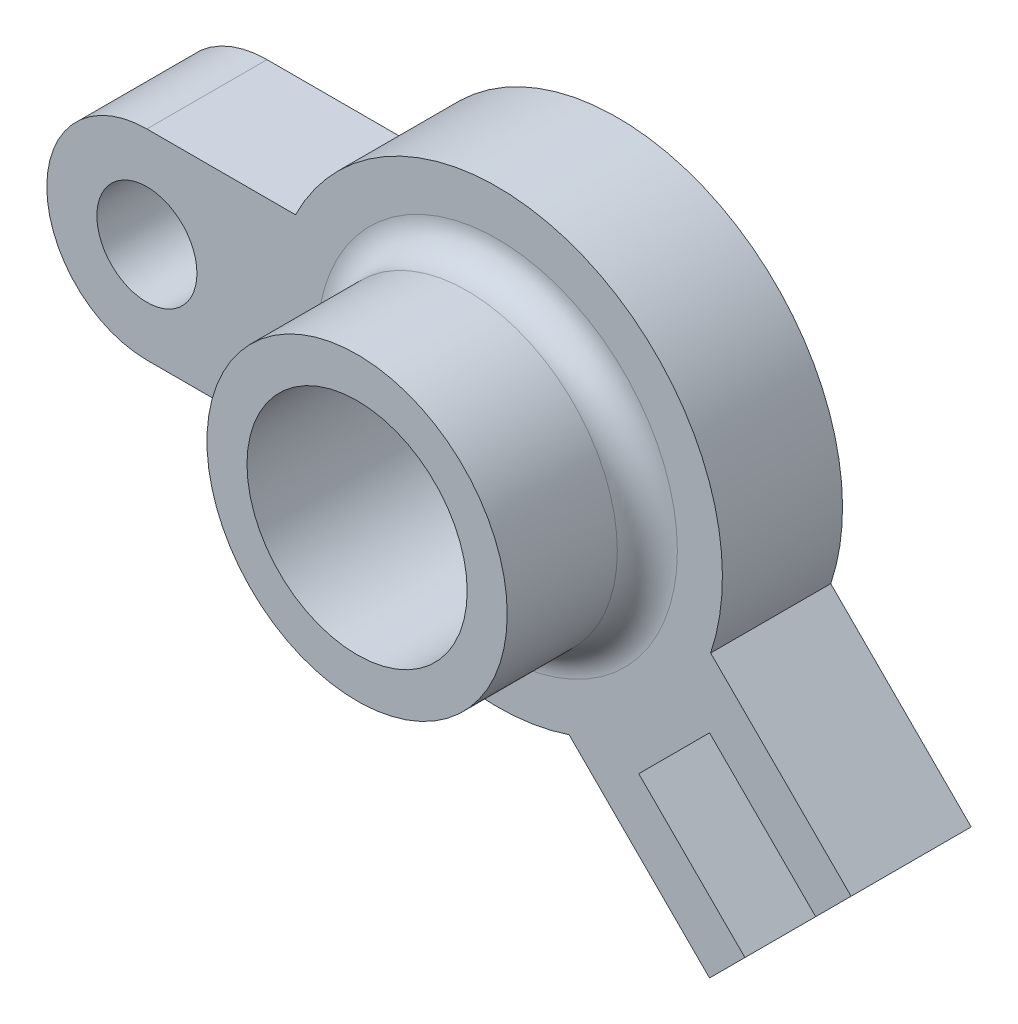
ISO-10303-21;
HEADER;
FILE_DESCRIPTION(('STEP AP214'),'2;1');
FILE_NAME('part.step','',(''),(''),'','','');
FILE_SCHEMA(('AUTOMOTIVE_DESIGN { 1 0 10303 214 1 1 1 1 }'));
ENDSEC;
DATA;
#1=APPLICATION_CONTEXT('core data for automotive mechanical design processes');
#2=APPLICATION_PROTOCOL_DEFINITION('international standard','automotive_design',2000,#1);
#3=PRODUCT_CONTEXT('',#1,'mechanical');
#4=PRODUCT('Part','Part','',(#3));
#5=PRODUCT_RELATED_PRODUCT_CATEGORY('part','',(#4));
#6=PRODUCT_DEFINITION_FORMATION('','',#4);
#7=PRODUCT_DEFINITION_CONTEXT('part definition',#1,'design');
#8=PRODUCT_DEFINITION('design','',#6,#7);
#9=PRODUCT_DEFINITION_SHAPE('','',#8);
#10=(LENGTH_UNIT() NAMED_UNIT(*) SI_UNIT(.MILLI.,.METRE.));
#11=(NAMED_UNIT(*) PLANE_ANGLE_UNIT() SI_UNIT($,.RADIAN.));
#12=(NAMED_UNIT(*) SI_UNIT($,.STERADIAN.) SOLID_ANGLE_UNIT());
#13=UNCERTAINTY_MEASURE_WITH_UNIT(LENGTH_MEASURE(1.E-05),#10,'distance_accuracy_value','');
#14=(GEOMETRIC_REPRESENTATION_CONTEXT(3) GLOBAL_UNCERTAINTY_ASSIGNED_CONTEXT((#13)) GLOBAL_UNIT_ASSIGNED_CONTEXT((#10,
#11,#12)) REPRESENTATION_CONTEXT('',''));
#15=CARTESIAN_POINT('',(0.,0.,0.));
#16=DIRECTION('',(0.,0.,1.));
#17=DIRECTION('',(1.,0.,0.));
#18=AXIS2_PLACEMENT_3D('',#15,#16,#17);
#19=CARTESIAN_POINT('',(0.,0.,12.));
#20=DIRECTION('',(0.,0.,-1.));
#21=DIRECTION('',(-1.,0.,0.));
#22=AXIS2_PLACEMENT_3D('',#19,#20,#21);
#23=CYLINDRICAL_SURFACE('',#22,22.5);
#24=CARTESIAN_POINT('',(0.,0.,0.));
#25=DIRECTION('',(0.,0.,1.));
#26=DIRECTION('',(1.,0.,0.));
#27=AXIS2_PLACEMENT_3D('',#24,#25,#26);
#28=CIRCLE('',#27,22.5);
#29=CARTESIAN_POINT('',(-20.1556443707464,-10.,0.));
#30=VERTEX_POINT('',#29);
#31=CARTESIAN_POINT('',(7.18112500187364,-21.3232606256047,0.));
#32=VERTEX_POINT('',#31);
#33=EDGE_CURVE('E156',#30,#32,#28,.T.);
#34=ORIENTED_EDGE('',*,*,#33,.T.);
#35=DIRECTION('',(0.,0.,-1.));
#36=VECTOR('',#35,1.);
#37=CARTESIAN_POINT('',(7.18112500187364,-21.3232606256047,12.));
#38=LINE('',#37,#36);
#39=CARTESIAN_POINT('',(7.18112500187364,-21.3232606256047,12.));
#40=VERTEX_POINT('',#39);
#41=EDGE_CURVE('E185',#40,#32,#38,.T.);
#42=ORIENTED_EDGE('',*,*,#41,.F.);
#43=CARTESIAN_POINT('',(0.,0.,12.));
#44=DIRECTION('',(0.,0.,1.));
#45=DIRECTION('',(1.,0.,0.));
#46=AXIS2_PLACEMENT_3D('',#43,#44,#45);
#47=CIRCLE('',#46,22.5);
#48=CARTESIAN_POINT('',(-20.1556443707464,-10.,12.));
#49=VERTEX_POINT('',#48);
#50=EDGE_CURVE('E172',#49,#40,#47,.T.);
#51=ORIENTED_EDGE('',*,*,#50,.F.);
#52=DIRECTION('',(0.,0.,-1.));
#53=VECTOR('',#52,1.);
#54=CARTESIAN_POINT('',(-20.1556443707464,-10.,12.));
#55=LINE('',#54,#53);
#56=EDGE_CURVE('E152',#49,#30,#55,.T.);
#57=ORIENTED_EDGE('',*,*,#56,.T.);
#58=EDGE_LOOP('',(#34,#42,#51,#57));
#59=FACE_BOUND('',#58,.T.);
#60=ADVANCED_FACE('F44',(#59),#23,.T.);
#61=CARTESIAN_POINT('',(7.18112500187364,-21.3232606256047,12.));
#62=DIRECTION('',(0.707106781186551,0.707106781186544,0.));
#63=DIRECTION('',(-0.707106781186544,0.707106781186551,0.));
#64=AXIS2_PLACEMENT_3D('',#61,#62,#63);
#65=PLANE('',#64);
#66=DIRECTION('',(0.707106781186544,-0.707106781186551,0.));
#67=VECTOR('',#66,1.);
#68=CARTESIAN_POINT('',(7.18112500187364,-21.3232606256047,0.));
#69=LINE('',#68,#67);
#70=CARTESIAN_POINT('',(21.2132034355962,-35.3553390593275,0.));
#71=VERTEX_POINT('',#70);
#72=EDGE_CURVE('E159',#32,#71,#69,.T.);
#73=ORIENTED_EDGE('',*,*,#72,.T.);
#74=DIRECTION('',(0.,0.,-1.));
#75=VECTOR('',#74,1.);
#76=CARTESIAN_POINT('',(21.2132034355962,-35.3553390593275,12.));
#77=LINE('',#76,#75);
#78=CARTESIAN_POINT('',(21.2132034355962,-35.3553390593275,12.));
#79=VERTEX_POINT('',#78);
#80=EDGE_CURVE('E182',#79,#71,#77,.T.);
#81=ORIENTED_EDGE('',*,*,#80,.F.);
#82=DIRECTION('',(0.707106781186544,-0.707106781186551,0.));
#83=VECTOR('',#82,1.);
#84=CARTESIAN_POINT('',(7.18112500187364,-21.3232606256047,12.));
#85=LINE('',#84,#83);
#86=EDGE_CURVE('E110',#40,#79,#85,.T.);
#87=ORIENTED_EDGE('',*,*,#86,.F.);
#88=ORIENTED_EDGE('',*,*,#41,.T.);
#89=EDGE_LOOP('',(#73,#81,#87,#88));
#90=FACE_BOUND('',#89,.T.);
#91=ADVANCED_FACE('F208',(#90),#65,.F.);
#92=CARTESIAN_POINT('',(35.3553390593273,-21.2132034355966,12.));
#93=DIRECTION('',(-0.707106781186544,0.707106781186551,0.));
#94=DIRECTION('',(-0.707106781186551,-0.707106781186544,0.));
#95=AXIS2_PLACEMENT_3D('',#92,#93,#94);
#96=PLANE('',#95);
#97=DIRECTION('',(0.707106781186547,0.707106781186548,0.));
#98=VECTOR('',#97,1.);
#99=CARTESIAN_POINT('',(24.748737341529,-31.8198051533947,4.));
#100=LINE('',#99,#98);
#101=CARTESIAN_POINT('',(24.748737341529,-31.8198051533947,4.));
#102=VERTEX_POINT('',#101);
#103=CARTESIAN_POINT('',(31.8198051533945,-24.7487373415293,4.));
#104=VERTEX_POINT('',#103);
#105=EDGE_CURVE('E278',#102,#104,#100,.T.);
#106=ORIENTED_EDGE('',*,*,#105,.F.);
#107=DIRECTION('',(0.,0.,1.));
#108=VECTOR('',#107,1.);
#109=CARTESIAN_POINT('',(24.748737341529,-31.8198051533947,4.));
#110=LINE('',#109,#108);
#111=CARTESIAN_POINT('',(24.748737341529,-31.8198051533947,12.));
#112=VERTEX_POINT('',#111);
#113=EDGE_CURVE('E295',#102,#112,#110,.T.);
#114=ORIENTED_EDGE('',*,*,#113,.T.);
#115=DIRECTION('',(0.707106781186551,0.707106781186544,0.));
#116=VECTOR('',#115,1.);
#117=CARTESIAN_POINT('',(35.3553390593273,-21.2132034355966,12.));
#118=LINE('',#117,#116);
#119=EDGE_CURVE('E316',#79,#112,#118,.T.);
#120=ORIENTED_EDGE('',*,*,#119,.F.);
#121=ORIENTED_EDGE('',*,*,#80,.T.);
#122=DIRECTION('',(0.707106781186551,0.707106781186544,0.));
#123=VECTOR('',#122,1.);
#124=CARTESIAN_POINT('',(35.3553390593273,-21.2132034355966,0.));
#125=LINE('',#124,#123);
#126=CARTESIAN_POINT('',(35.3553390593273,-21.2132034355966,0.));
#127=VERTEX_POINT('',#126);
#128=EDGE_CURVE('E162',#71,#127,#125,.T.);
#129=ORIENTED_EDGE('',*,*,#128,.T.);
#130=DIRECTION('',(0.,0.,-1.));
#131=VECTOR('',#130,1.);
#132=CARTESIAN_POINT('',(35.3553390593273,-21.2132034355966,12.));
#133=LINE('',#132,#131);
#134=CARTESIAN_POINT('',(35.3553390593273,-21.2132034355966,12.));
#135=VERTEX_POINT('',#134);
#136=EDGE_CURVE('E179',#135,#127,#133,.T.);
#137=ORIENTED_EDGE('',*,*,#136,.F.);
#138=CARTESIAN_POINT('',(31.8198051533945,-24.7487373415293,12.));
#139=VERTEX_POINT('',#138);
#140=EDGE_CURVE('E315',#139,#135,#118,.T.);
#141=ORIENTED_EDGE('',*,*,#140,.F.);
#142=DIRECTION('',(0.,0.,1.));
#143=VECTOR('',#142,1.);
#144=CARTESIAN_POINT('',(31.8198051533945,-24.7487373415293,4.));
#145=LINE('',#144,#143);
#146=EDGE_CURVE('E59',#104,#139,#145,.T.);
#147=ORIENTED_EDGE('',*,*,#146,.F.);
#148=EDGE_LOOP('',(#106,#114,#120,#121,#129,#137,#141,#147));
#149=FACE_BOUND('',#148,.T.);
#150=ADVANCED_FACE('F213',(#149),#96,.F.);
#151=CARTESIAN_POINT('',(21.3232606256047,-7.18112500187386,12.));
#152=DIRECTION('',(-0.707106781186551,-0.707106781186544,0.));
#153=DIRECTION('',(0.707106781186544,-0.707106781186551,0.));
#154=AXIS2_PLACEMENT_3D('',#151,#152,#153);
#155=PLANE('',#154);
#156=DIRECTION('',(-0.707106781186544,0.707106781186551,0.));
#157=VECTOR('',#156,1.);
#158=CARTESIAN_POINT('',(21.3232606256047,-7.18112500187386,0.));
#159=LINE('',#158,#157);
#160=CARTESIAN_POINT('',(21.3232606256047,-7.18112500187386,0.));
#161=VERTEX_POINT('',#160);
#162=EDGE_CURVE('E164',#127,#161,#159,.T.);
#163=ORIENTED_EDGE('',*,*,#162,.T.);
#164=DIRECTION('',(0.,0.,-1.));
#165=VECTOR('',#164,1.);
#166=CARTESIAN_POINT('',(21.3232606256047,-7.18112500187386,12.));
#167=LINE('',#166,#165);
#168=CARTESIAN_POINT('',(21.3232606256047,-7.18112500187386,12.));
#169=VERTEX_POINT('',#168);
#170=EDGE_CURVE('E176',#169,#161,#167,.T.);
#171=ORIENTED_EDGE('',*,*,#170,.F.);
#172=DIRECTION('',(-0.707106781186544,0.707106781186551,0.));
#173=VECTOR('',#172,1.);
#174=CARTESIAN_POINT('',(21.3232606256047,-7.18112500187386,12.));
#175=LINE('',#174,#173);
#176=EDGE_CURVE('E319',#135,#169,#175,.T.);
#177=ORIENTED_EDGE('',*,*,#176,.F.);
#178=ORIENTED_EDGE('',*,*,#136,.T.);
#179=EDGE_LOOP('',(#163,#171,#177,#178));
#180=FACE_BOUND('',#179,.T.);
#181=ADVANCED_FACE('F218',(#180),#155,.F.);
#182=CARTESIAN_POINT('',(0.,0.,12.));
#183=DIRECTION('',(0.,0.,-1.));
#184=DIRECTION('',(-1.,0.,0.));
#185=AXIS2_PLACEMENT_3D('',#182,#183,#184);
#186=CYLINDRICAL_SURFACE('',#185,22.5);
#187=CARTESIAN_POINT('',(0.,0.,0.));
#188=DIRECTION('',(0.,0.,1.));
#189=DIRECTION('',(1.,0.,0.));
#190=AXIS2_PLACEMENT_3D('',#187,#188,#189);
#191=CIRCLE('',#190,22.5);
#192=CARTESIAN_POINT('',(-20.1556443707464,10.,0.));
#193=VERTEX_POINT('',#192);
#194=EDGE_CURVE('E166',#161,#193,#191,.T.);
#195=ORIENTED_EDGE('',*,*,#194,.T.);
#196=DIRECTION('',(0.,0.,-1.));
#197=VECTOR('',#196,1.);
#198=CARTESIAN_POINT('',(-20.1556443707464,10.,12.));
#199=LINE('',#198,#197);
#200=CARTESIAN_POINT('',(-20.1556443707464,10.,12.));
#201=VERTEX_POINT('',#200);
#202=EDGE_CURVE('E147',#201,#193,#199,.T.);
#203=ORIENTED_EDGE('',*,*,#202,.F.);
#204=CARTESIAN_POINT('',(0.,0.,12.));
#205=DIRECTION('',(0.,0.,1.));
#206=DIRECTION('',(1.,0.,0.));
#207=AXIS2_PLACEMENT_3D('',#204,#205,#206);
#208=CIRCLE('',#207,22.5);
#209=EDGE_CURVE('E135',#169,#201,#208,.T.);
#210=ORIENTED_EDGE('',*,*,#209,.F.);
#211=ORIENTED_EDGE('',*,*,#170,.T.);
#212=EDGE_LOOP('',(#195,#203,#210,#211));
#213=FACE_BOUND('',#212,.T.);
#214=ADVANCED_FACE('F222',(#213),#186,.T.);
#215=CARTESIAN_POINT('',(-20.1556443707464,10.,12.));
#216=DIRECTION('',(0.,-1.,0.));
#217=DIRECTION('',(0.,0.,-1.));
#218=AXIS2_PLACEMENT_3D('',#215,#216,#217);
#219=PLANE('',#218);
#220=DIRECTION('',(-1.,0.,0.));
#221=VECTOR('',#220,1.);
#222=CARTESIAN_POINT('',(-20.1556443707464,10.,0.));
#223=LINE('',#222,#221);
#224=CARTESIAN_POINT('',(-35.,10.,0.));
#225=VERTEX_POINT('',#224);
#226=EDGE_CURVE('E144',#193,#225,#223,.T.);
#227=ORIENTED_EDGE('',*,*,#226,.T.);
#228=DIRECTION('',(0.,0.,-1.));
#229=VECTOR('',#228,1.);
#230=CARTESIAN_POINT('',(-35.,10.,12.));
#231=LINE('',#230,#229);
#232=CARTESIAN_POINT('',(-35.,10.,12.));
#233=VERTEX_POINT('',#232);
#234=EDGE_CURVE('E141',#233,#225,#231,.T.);
#235=ORIENTED_EDGE('',*,*,#234,.F.);
#236=DIRECTION('',(-1.,0.,0.));
#237=VECTOR('',#236,1.);
#238=CARTESIAN_POINT('',(-20.1556443707464,10.,12.));
#239=LINE('',#238,#237);
#240=EDGE_CURVE('E126',#201,#233,#239,.T.);
#241=ORIENTED_EDGE('',*,*,#240,.F.);
#242=ORIENTED_EDGE('',*,*,#202,.T.);
#243=EDGE_LOOP('',(#227,#235,#241,#242));
#244=FACE_BOUND('',#243,.T.);
#245=ADVANCED_FACE('F142',(#244),#219,.F.);
#246=CARTESIAN_POINT('',(-35.,0.,12.));
#247=DIRECTION('',(0.,0.,-1.));
#248=DIRECTION('',(-1.,0.,0.));
#249=AXIS2_PLACEMENT_3D('',#246,#247,#248);
#250=CYLINDRICAL_SURFACE('',#249,10.);
#251=CARTESIAN_POINT('',(-35.,0.,0.));
#252=DIRECTION('',(0.,0.,1.));
#253=DIRECTION('',(1.,0.,0.));
#254=AXIS2_PLACEMENT_3D('',#251,#252,#253);
#255=CIRCLE('',#254,10.);
#256=CARTESIAN_POINT('',(-35.,-10.,0.));
#257=VERTEX_POINT('',#256);
#258=EDGE_CURVE('E169',#225,#257,#255,.T.);
#259=ORIENTED_EDGE('',*,*,#258,.T.);
#260=DIRECTION('',(0.,0.,-1.));
#261=VECTOR('',#260,1.);
#262=CARTESIAN_POINT('',(-35.,-10.,12.));
#263=LINE('',#262,#261);
#264=CARTESIAN_POINT('',(-35.,-10.,12.));
#265=VERTEX_POINT('',#264);
#266=EDGE_CURVE('E148',#265,#257,#263,.T.);
#267=ORIENTED_EDGE('',*,*,#266,.F.);
#268=CARTESIAN_POINT('',(-35.,0.,12.));
#269=DIRECTION('',(0.,0.,1.));
#270=DIRECTION('',(1.,0.,0.));
#271=AXIS2_PLACEMENT_3D('',#268,#269,#270);
#272=CIRCLE('',#271,10.);
#273=EDGE_CURVE('E132',#233,#265,#272,.T.);
#274=ORIENTED_EDGE('',*,*,#273,.F.);
#275=ORIENTED_EDGE('',*,*,#234,.T.);
#276=EDGE_LOOP('',(#259,#267,#274,#275));
#277=FACE_BOUND('',#276,.T.);
#278=ADVANCED_FACE('F150',(#277),#250,.T.);
#279=CARTESIAN_POINT('',(-20.1556443707464,-10.,12.));
#280=DIRECTION('',(0.,1.,0.));
#281=DIRECTION('',(0.,0.,1.));
#282=AXIS2_PLACEMENT_3D('',#279,#280,#281);
#283=PLANE('',#282);
#284=DIRECTION('',(1.,0.,0.));
#285=VECTOR('',#284,1.);
#286=CARTESIAN_POINT('',(-20.1556443707464,-10.,0.));
#287=LINE('',#286,#285);
#288=EDGE_CURVE('E101',#257,#30,#287,.T.);
#289=ORIENTED_EDGE('',*,*,#288,.T.);
#290=ORIENTED_EDGE('',*,*,#56,.F.);
#291=DIRECTION('',(1.,0.,0.));
#292=VECTOR('',#291,1.);
#293=CARTESIAN_POINT('',(-20.1556443707464,-10.,12.));
#294=LINE('',#293,#292);
#295=EDGE_CURVE('E68',#265,#49,#294,.T.);
#296=ORIENTED_EDGE('',*,*,#295,.F.);
#297=ORIENTED_EDGE('',*,*,#266,.T.);
#298=EDGE_LOOP('',(#289,#290,#296,#297));
#299=FACE_BOUND('',#298,.T.);
#300=ADVANCED_FACE('F231',(#299),#283,.F.);
#301=CARTESIAN_POINT('',(0.,0.,12.));
#302=DIRECTION('',(0.,0.,1.));
#303=DIRECTION('',(1.,0.,0.));
#304=AXIS2_PLACEMENT_3D('',#301,#302,#303);
#305=PLANE('',#304);
#306=CARTESIAN_POINT('',(-35.,0.,12.));
#307=DIRECTION('',(0.,0.,1.));
#308=DIRECTION('',(1.,0.,0.));
#309=AXIS2_PLACEMENT_3D('',#306,#307,#308);
#310=CIRCLE('',#309,5.);
#311=CARTESIAN_POINT('',(-30.,0.,12.));
#312=VERTEX_POINT('',#311);
#313=EDGE_CURVE('E268',#312,#312,#310,.T.);
#314=ORIENTED_EDGE('',*,*,#313,.F.);
#315=EDGE_LOOP('',(#314));
#316=FACE_BOUND('',#315,.T.);
#317=DIRECTION('',(0.707106781186548,-0.707106781186547,0.));
#318=VECTOR('',#317,1.);
#319=CARTESIAN_POINT('',(14.1421356237308,-21.2132034355966,12.));
#320=LINE('',#319,#318);
#321=CARTESIAN_POINT('',(14.1421356237308,-21.2132034355966,12.));
#322=VERTEX_POINT('',#321);
#323=EDGE_CURVE('E282',#322,#112,#320,.T.);
#324=ORIENTED_EDGE('',*,*,#323,.F.);
#325=DIRECTION('',(-0.707106781186547,-0.707106781186548,0.));
#326=VECTOR('',#325,1.);
#327=CARTESIAN_POINT('',(21.2132034355963,-14.1421356237311,12.));
#328=LINE('',#327,#326);
#329=CARTESIAN_POINT('',(21.2132034355963,-14.1421356237311,12.));
#330=VERTEX_POINT('',#329);
#331=EDGE_CURVE('E274',#330,#322,#328,.T.);
#332=ORIENTED_EDGE('',*,*,#331,.F.);
#333=DIRECTION('',(-0.707106781186548,0.707106781186547,0.));
#334=VECTOR('',#333,1.);
#335=CARTESIAN_POINT('',(31.8198051533945,-24.7487373415293,12.));
#336=LINE('',#335,#334);
#337=EDGE_CURVE('E272',#139,#330,#336,.T.);
#338=ORIENTED_EDGE('',*,*,#337,.F.);
#339=ORIENTED_EDGE('',*,*,#140,.T.);
#340=ORIENTED_EDGE('',*,*,#176,.T.);
#341=ORIENTED_EDGE('',*,*,#209,.T.);
#342=ORIENTED_EDGE('',*,*,#240,.T.);
#343=ORIENTED_EDGE('',*,*,#273,.T.);
#344=ORIENTED_EDGE('',*,*,#295,.T.);
#345=ORIENTED_EDGE('',*,*,#50,.T.);
#346=ORIENTED_EDGE('',*,*,#86,.T.);
#347=ORIENTED_EDGE('',*,*,#119,.T.);
#348=EDGE_LOOP('',(#324,#332,#338,#339,#340,#341,#342,#343,#344,#345,#346,#347));
#349=FACE_BOUND('',#348,.T.);
#350=CARTESIAN_POINT('',(0.,0.,12.));
#351=DIRECTION('',(0.,0.,1.));
#352=DIRECTION('',(1.,0.,0.));
#353=AXIS2_PLACEMENT_3D('',#350,#351,#352);
#354=CIRCLE('',#353,18.);
#355=CARTESIAN_POINT('',(18.,0.,12.));
#356=VERTEX_POINT('',#355);
#357=EDGE_CURVE('E13',#356,#356,#354,.F.);
#358=ORIENTED_EDGE('',*,*,#357,.T.);
#359=EDGE_LOOP('',(#358));
#360=FACE_BOUND('',#359,.T.);
#361=ADVANCED_FACE('F129',(#316,#349,#360),#305,.T.);
#362=CARTESIAN_POINT('',(0.,0.,0.));
#363=DIRECTION('',(0.,0.,1.));
#364=DIRECTION('',(1.,0.,0.));
#365=AXIS2_PLACEMENT_3D('',#362,#363,#364);
#366=PLANE('',#365);
#367=CARTESIAN_POINT('',(-35.,0.,0.));
#368=DIRECTION('',(0.,0.,1.));
#369=DIRECTION('',(1.,0.,0.));
#370=AXIS2_PLACEMENT_3D('',#367,#368,#369);
#371=CIRCLE('',#370,5.);
#372=CARTESIAN_POINT('',(-30.,0.,0.));
#373=VERTEX_POINT('',#372);
#374=EDGE_CURVE('E271',#373,#373,#371,.F.);
#375=ORIENTED_EDGE('',*,*,#374,.F.);
#376=EDGE_LOOP('',(#375));
#377=FACE_BOUND('',#376,.T.);
#378=ORIENTED_EDGE('',*,*,#33,.F.);
#379=ORIENTED_EDGE('',*,*,#288,.F.);
#380=ORIENTED_EDGE('',*,*,#258,.F.);
#381=ORIENTED_EDGE('',*,*,#226,.F.);
#382=ORIENTED_EDGE('',*,*,#194,.F.);
#383=ORIENTED_EDGE('',*,*,#162,.F.);
#384=ORIENTED_EDGE('',*,*,#128,.F.);
#385=ORIENTED_EDGE('',*,*,#72,.F.);
#386=EDGE_LOOP('',(#378,#379,#380,#381,#382,#383,#384,#385));
#387=FACE_BOUND('',#386,.T.);
#388=ADVANCED_FACE('F234',(#377,#387),#366,.F.);
#389=CARTESIAN_POINT('',(0.,0.,26.));
#390=DIRECTION('',(0.,0.,-1.));
#391=DIRECTION('',(-1.,0.,0.));
#392=AXIS2_PLACEMENT_3D('',#389,#390,#391);
#393=CYLINDRICAL_SURFACE('',#392,15.);
#394=CARTESIAN_POINT('',(0.,0.,15.));
#395=DIRECTION('',(0.,0.,1.));
#396=DIRECTION('',(1.,0.,0.));
#397=AXIS2_PLACEMENT_3D('',#394,#395,#396);
#398=CIRCLE('',#397,15.);
#399=CARTESIAN_POINT('',(15.,0.,15.));
#400=VERTEX_POINT('',#399);
#401=EDGE_CURVE('E52',#400,#400,#398,.T.);
#402=ORIENTED_EDGE('',*,*,#401,.T.);
#403=EDGE_LOOP('',(#402));
#404=FACE_BOUND('',#403,.T.);
#405=CARTESIAN_POINT('',(0.,0.,26.));
#406=DIRECTION('',(0.,0.,1.));
#407=DIRECTION('',(1.,0.,0.));
#408=AXIS2_PLACEMENT_3D('',#405,#406,#407);
#409=CIRCLE('',#408,15.);
#410=CARTESIAN_POINT('',(15.,0.,26.));
#411=VERTEX_POINT('',#410);
#412=EDGE_CURVE('E160',#411,#411,#409,.T.);
#413=ORIENTED_EDGE('',*,*,#412,.F.);
#414=EDGE_LOOP('',(#413));
#415=FACE_BOUND('',#414,.T.);
#416=ADVANCED_FACE('F189',(#404,#415),#393,.T.);
#417=CARTESIAN_POINT('',(0.,0.,26.));
#418=DIRECTION('',(0.,0.,1.));
#419=DIRECTION('',(1.,0.,0.));
#420=AXIS2_PLACEMENT_3D('',#417,#418,#419);
#421=PLANE('',#420);
#422=CARTESIAN_POINT('',(0.,0.,26.));
#423=DIRECTION('',(0.,0.,1.));
#424=DIRECTION('',(1.,0.,0.));
#425=AXIS2_PLACEMENT_3D('',#422,#423,#424);
#426=CIRCLE('',#425,11.);
#427=CARTESIAN_POINT('',(11.,0.,26.));
#428=VERTEX_POINT('',#427);
#429=EDGE_CURVE('E298',#428,#428,#426,.T.);
#430=ORIENTED_EDGE('',*,*,#429,.F.);
#431=EDGE_LOOP('',(#430));
#432=FACE_BOUND('',#431,.T.);
#433=ORIENTED_EDGE('',*,*,#412,.T.);
#434=EDGE_LOOP('',(#433));
#435=FACE_BOUND('',#434,.T.);
#436=ADVANCED_FACE('F243',(#432,#435),#421,.T.);
#437=CARTESIAN_POINT('',(0.,0.,8.));
#438=DIRECTION('',(0.,0.,1.));
#439=DIRECTION('',(1.,0.,0.));
#440=AXIS2_PLACEMENT_3D('',#437,#438,#439);
#441=CYLINDRICAL_SURFACE('',#440,11.);
#442=CARTESIAN_POINT('',(0.,0.,8.));
#443=DIRECTION('',(0.,0.,1.));
#444=DIRECTION('',(1.,0.,0.));
#445=AXIS2_PLACEMENT_3D('',#442,#443,#444);
#446=CIRCLE('',#445,11.);
#447=CARTESIAN_POINT('',(11.,0.,8.));
#448=VERTEX_POINT('',#447);
#449=EDGE_CURVE('E306',#448,#448,#446,.T.);
#450=ORIENTED_EDGE('',*,*,#449,.F.);
#451=EDGE_LOOP('',(#450));
#452=FACE_BOUND('',#451,.T.);
#453=ORIENTED_EDGE('',*,*,#429,.T.);
#454=EDGE_LOOP('',(#453));
#455=FACE_BOUND('',#454,.T.);
#456=ADVANCED_FACE('F203',(#452,#455),#441,.F.);
#457=CARTESIAN_POINT('',(0.,0.,8.));
#458=DIRECTION('',(0.,0.,1.));
#459=DIRECTION('',(1.,0.,0.));
#460=AXIS2_PLACEMENT_3D('',#457,#458,#459);
#461=PLANE('',#460);
#462=ORIENTED_EDGE('',*,*,#449,.T.);
#463=EDGE_LOOP('',(#462));
#464=FACE_BOUND('',#463,.T.);
#465=ADVANCED_FACE('F194',(#464),#461,.T.);
#466=CARTESIAN_POINT('',(0.,0.,15.));
#467=DIRECTION('',(0.,0.,1.));
#468=DIRECTION('',(1.,0.,0.));
#469=AXIS2_PLACEMENT_3D('',#466,#467,#468);
#470=TOROIDAL_SURFACE('',#469,18.,3.);
#471=ORIENTED_EDGE('',*,*,#357,.F.);
#472=EDGE_LOOP('',(#471));
#473=FACE_BOUND('',#472,.T.);
#474=ORIENTED_EDGE('',*,*,#401,.F.);
#475=EDGE_LOOP('',(#474));
#476=FACE_BOUND('',#475,.T.);
#477=ADVANCED_FACE('F46',(#473,#476),#470,.F.);
#478=CARTESIAN_POINT('',(14.1421356237308,-21.2132034355966,4.));
#479=DIRECTION('',(-0.707106781186547,-0.707106781186548,0.));
#480=DIRECTION('',(0.707106781186548,-0.707106781186547,0.));
#481=AXIS2_PLACEMENT_3D('',#478,#479,#480);
#482=PLANE('',#481);
#483=ORIENTED_EDGE('',*,*,#323,.T.);
#484=ORIENTED_EDGE('',*,*,#113,.F.);
#485=DIRECTION('',(0.707106781186548,-0.707106781186547,0.));
#486=VECTOR('',#485,1.);
#487=CARTESIAN_POINT('',(14.1421356237308,-21.2132034355966,4.));
#488=LINE('',#487,#486);
#489=CARTESIAN_POINT('',(14.1421356237308,-21.2132034355966,4.));
#490=VERTEX_POINT('',#489);
#491=EDGE_CURVE('E288',#490,#102,#488,.T.);
#492=ORIENTED_EDGE('',*,*,#491,.F.);
#493=DIRECTION('',(0.,0.,1.));
#494=VECTOR('',#493,1.);
#495=CARTESIAN_POINT('',(14.1421356237308,-21.2132034355966,4.));
#496=LINE('',#495,#494);
#497=EDGE_CURVE('E299',#490,#322,#496,.T.);
#498=ORIENTED_EDGE('',*,*,#497,.T.);
#499=EDGE_LOOP('',(#483,#484,#492,#498));
#500=FACE_BOUND('',#499,.T.);
#501=ADVANCED_FACE('F193',(#500),#482,.F.);
#502=CARTESIAN_POINT('',(21.2132034355963,-14.1421356237311,4.));
#503=DIRECTION('',(-0.707106781186548,0.707106781186547,0.));
#504=DIRECTION('',(-0.707106781186547,-0.707106781186548,0.));
#505=AXIS2_PLACEMENT_3D('',#502,#503,#504);
#506=PLANE('',#505);
#507=ORIENTED_EDGE('',*,*,#331,.T.);
#508=ORIENTED_EDGE('',*,*,#497,.F.);
#509=DIRECTION('',(-0.707106781186547,-0.707106781186548,0.));
#510=VECTOR('',#509,1.);
#511=CARTESIAN_POINT('',(21.2132034355963,-14.1421356237311,4.));
#512=LINE('',#511,#510);
#513=CARTESIAN_POINT('',(21.2132034355963,-14.1421356237311,4.));
#514=VERTEX_POINT('',#513);
#515=EDGE_CURVE('E285',#514,#490,#512,.T.);
#516=ORIENTED_EDGE('',*,*,#515,.F.);
#517=DIRECTION('',(0.,0.,1.));
#518=VECTOR('',#517,1.);
#519=CARTESIAN_POINT('',(21.2132034355963,-14.1421356237311,4.));
#520=LINE('',#519,#518);
#521=EDGE_CURVE('E302',#514,#330,#520,.T.);
#522=ORIENTED_EDGE('',*,*,#521,.T.);
#523=EDGE_LOOP('',(#507,#508,#516,#522));
#524=FACE_BOUND('',#523,.T.);
#525=ADVANCED_FACE('F200',(#524),#506,.F.);
#526=CARTESIAN_POINT('',(31.8198051533945,-24.7487373415293,4.));
#527=DIRECTION('',(0.707106781186547,0.707106781186548,0.));
#528=DIRECTION('',(-0.707106781186548,0.707106781186547,0.));
#529=AXIS2_PLACEMENT_3D('',#526,#527,#528);
#530=PLANE('',#529);
#531=ORIENTED_EDGE('',*,*,#337,.T.);
#532=ORIENTED_EDGE('',*,*,#521,.F.);
#533=DIRECTION('',(-0.707106781186548,0.707106781186547,0.));
#534=VECTOR('',#533,1.);
#535=CARTESIAN_POINT('',(31.8198051533945,-24.7487373415293,4.));
#536=LINE('',#535,#534);
#537=EDGE_CURVE('E281',#104,#514,#536,.T.);
#538=ORIENTED_EDGE('',*,*,#537,.F.);
#539=ORIENTED_EDGE('',*,*,#146,.T.);
#540=EDGE_LOOP('',(#531,#532,#538,#539));
#541=FACE_BOUND('',#540,.T.);
#542=ADVANCED_FACE('F250',(#541),#530,.F.);
#543=CARTESIAN_POINT('',(0.,0.,4.));
#544=DIRECTION('',(0.,0.,1.));
#545=DIRECTION('',(1.,0.,0.));
#546=AXIS2_PLACEMENT_3D('',#543,#544,#545);
#547=PLANE('',#546);
#548=ORIENTED_EDGE('',*,*,#105,.T.);
#549=ORIENTED_EDGE('',*,*,#537,.T.);
#550=ORIENTED_EDGE('',*,*,#515,.T.);
#551=ORIENTED_EDGE('',*,*,#491,.T.);
#552=EDGE_LOOP('',(#548,#549,#550,#551));
#553=FACE_BOUND('',#552,.T.);
#554=ADVANCED_FACE('F253',(#553),#547,.T.);
#555=CARTESIAN_POINT('',(-35.,0.,-0.000999999999999265));
#556=DIRECTION('',(0.,0.,1.));
#557=DIRECTION('',(1.,0.,0.));
#558=AXIS2_PLACEMENT_3D('',#555,#556,#557);
#559=CYLINDRICAL_SURFACE('',#558,5.);
#560=ORIENTED_EDGE('',*,*,#313,.T.);
#561=EDGE_LOOP('',(#560));
#562=FACE_BOUND('',#561,.T.);
#563=ORIENTED_EDGE('',*,*,#374,.T.);
#564=EDGE_LOOP('',(#563));
#565=FACE_BOUND('',#564,.T.);
#566=ADVANCED_FACE('F259',(#562,#565),#559,.F.);
#567=CLOSED_SHELL('',(#60,#91,#150,#181,#214,#245,#278,#300,#361,#388,#416,#436,#456,#465,#477,
#501,#525,#542,#554,#566));
#568=MANIFOLD_SOLID_BREP('B2',#567);
#569=ADVANCED_BREP_SHAPE_REPRESENTATION('',(#18,#568),#14);
#570=SHAPE_DEFINITION_REPRESENTATION(#9,#569);
ENDSEC;
END-ISO-10303-21;
